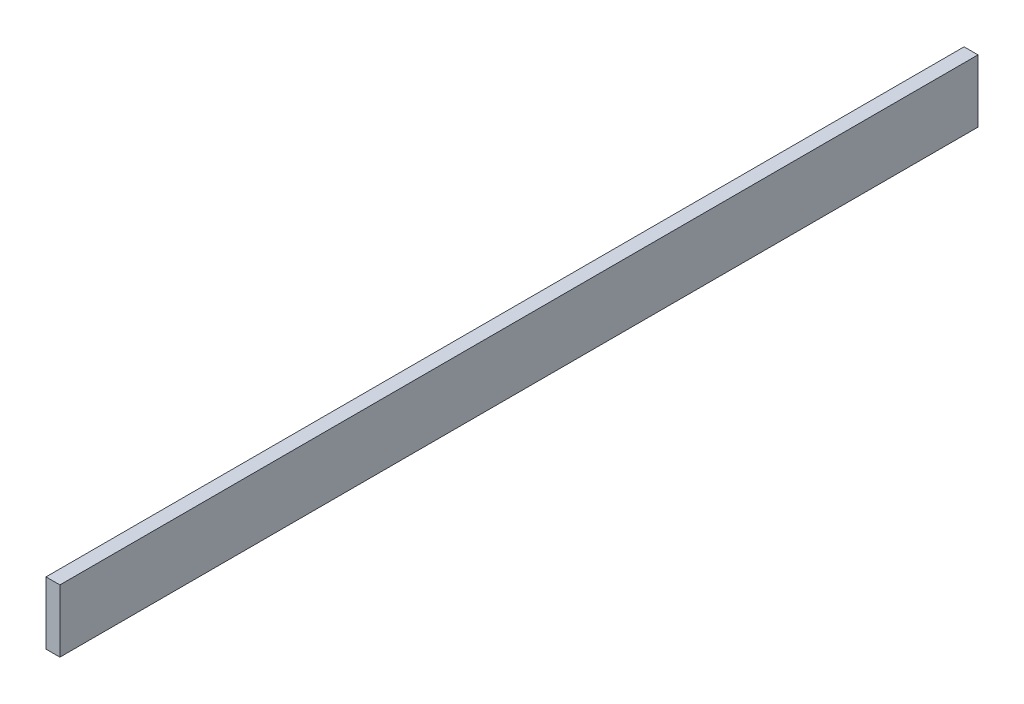
ISO-10303-21;
HEADER;
FILE_DESCRIPTION(('STEP AP214'),'2;1');
FILE_NAME('part.step','',(''),(''),'','','');
FILE_SCHEMA(('AUTOMOTIVE_DESIGN { 1 0 10303 214 1 1 1 1 }'));
ENDSEC;
DATA;
#1=APPLICATION_CONTEXT('core data for automotive mechanical design processes');
#2=APPLICATION_PROTOCOL_DEFINITION('international standard','automotive_design',2000,#1);
#3=PRODUCT_CONTEXT('',#1,'mechanical');
#4=PRODUCT('Part','Part','',(#3));
#5=PRODUCT_RELATED_PRODUCT_CATEGORY('part','',(#4));
#6=PRODUCT_DEFINITION_FORMATION('','',#4);
#7=PRODUCT_DEFINITION_CONTEXT('part definition',#1,'design');
#8=PRODUCT_DEFINITION('design','',#6,#7);
#9=PRODUCT_DEFINITION_SHAPE('','',#8);
#10=(LENGTH_UNIT() NAMED_UNIT(*) SI_UNIT(.MILLI.,.METRE.));
#11=(NAMED_UNIT(*) PLANE_ANGLE_UNIT() SI_UNIT($,.RADIAN.));
#12=(NAMED_UNIT(*) SI_UNIT($,.STERADIAN.) SOLID_ANGLE_UNIT());
#13=UNCERTAINTY_MEASURE_WITH_UNIT(LENGTH_MEASURE(1.E-05),#10,'distance_accuracy_value','');
#14=(GEOMETRIC_REPRESENTATION_CONTEXT(3) GLOBAL_UNCERTAINTY_ASSIGNED_CONTEXT((#13)) GLOBAL_UNIT_ASSIGNED_CONTEXT((#10,
#11,#12)) REPRESENTATION_CONTEXT('',''));
#15=CARTESIAN_POINT('',(0.,0.,0.));
#16=DIRECTION('',(0.,0.,1.));
#17=DIRECTION('',(1.,0.,0.));
#18=AXIS2_PLACEMENT_3D('',#15,#16,#17);
#19=CARTESIAN_POINT('',(20.,28.7695494129221,0.));
#20=DIRECTION('',(0.,-1.,0.));
#21=DIRECTION('',(0.,0.,-1.));
#22=AXIS2_PLACEMENT_3D('',#19,#20,#21);
#23=PLANE('',#22);
#24=DIRECTION('',(0.,0.,1.));
#25=VECTOR('',#24,1.);
#26=CARTESIAN_POINT('',(0.,28.7695494129221,0.));
#27=LINE('',#26,#25);
#28=CARTESIAN_POINT('',(0.,28.7695494129222,-1192.10741789365));
#29=VERTEX_POINT('',#28);
#30=CARTESIAN_POINT('',(0.,28.7695494129221,127.892582106352));
#31=VERTEX_POINT('',#30);
#32=EDGE_CURVE('E97',#29,#31,#27,.T.);
#33=ORIENTED_EDGE('',*,*,#32,.T.);
#34=DIRECTION('',(-1.,0.,0.));
#35=VECTOR('',#34,1.);
#36=CARTESIAN_POINT('',(20.,28.7695494129221,127.892582106352));
#37=LINE('',#36,#35);
#38=CARTESIAN_POINT('',(20.,28.7695494129221,127.892582106352));
#39=VERTEX_POINT('',#38);
#40=EDGE_CURVE('E11',#39,#31,#37,.T.);
#41=ORIENTED_EDGE('',*,*,#40,.F.);
#42=DIRECTION('',(0.,0.,1.));
#43=VECTOR('',#42,1.);
#44=CARTESIAN_POINT('',(20.,28.7695494129221,0.));
#45=LINE('',#44,#43);
#46=CARTESIAN_POINT('',(20.,28.7695494129222,-1192.10741789365));
#47=VERTEX_POINT('',#46);
#48=EDGE_CURVE('E83',#47,#39,#45,.T.);
#49=ORIENTED_EDGE('',*,*,#48,.F.);
#50=DIRECTION('',(-1.,0.,0.));
#51=VECTOR('',#50,1.);
#52=CARTESIAN_POINT('',(20.,28.7695494129222,-1192.10741789365));
#53=LINE('',#52,#51);
#54=EDGE_CURVE('E50',#47,#29,#53,.T.);
#55=ORIENTED_EDGE('',*,*,#54,.T.);
#56=EDGE_LOOP('',(#33,#41,#49,#55));
#57=FACE_BOUND('',#56,.T.);
#58=ADVANCED_FACE('F34',(#57),#23,.F.);
#59=CARTESIAN_POINT('',(20.,0.,127.892582106352));
#60=DIRECTION('',(0.,0.,-1.));
#61=DIRECTION('',(-1.,0.,0.));
#62=AXIS2_PLACEMENT_3D('',#59,#60,#61);
#63=PLANE('',#62);
#64=DIRECTION('',(0.,-1.,0.));
#65=VECTOR('',#64,1.);
#66=CARTESIAN_POINT('',(0.,0.,127.892582106352));
#67=LINE('',#66,#65);
#68=CARTESIAN_POINT('',(0.,-61.2304505870779,127.892582106352));
#69=VERTEX_POINT('',#68);
#70=EDGE_CURVE('E88',#31,#69,#67,.T.);
#71=ORIENTED_EDGE('',*,*,#70,.T.);
#72=DIRECTION('',(-1.,0.,0.));
#73=VECTOR('',#72,1.);
#74=CARTESIAN_POINT('',(20.,-61.2304505870779,127.892582106352));
#75=LINE('',#74,#73);
#76=CARTESIAN_POINT('',(20.,-61.2304505870779,127.892582106352));
#77=VERTEX_POINT('',#76);
#78=EDGE_CURVE('E42',#77,#69,#75,.T.);
#79=ORIENTED_EDGE('',*,*,#78,.F.);
#80=DIRECTION('',(0.,-1.,0.));
#81=VECTOR('',#80,1.);
#82=CARTESIAN_POINT('',(20.,0.,127.892582106352));
#83=LINE('',#82,#81);
#84=EDGE_CURVE('E75',#39,#77,#83,.T.);
#85=ORIENTED_EDGE('',*,*,#84,.F.);
#86=ORIENTED_EDGE('',*,*,#40,.T.);
#87=EDGE_LOOP('',(#71,#79,#85,#86));
#88=FACE_BOUND('',#87,.T.);
#89=ADVANCED_FACE('F87',(#88),#63,.F.);
#90=CARTESIAN_POINT('',(20.,-61.2304505870779,0.));
#91=DIRECTION('',(0.,-1.,0.));
#92=DIRECTION('',(0.,0.,-1.));
#93=AXIS2_PLACEMENT_3D('',#90,#91,#92);
#94=PLANE('',#93);
#95=DIRECTION('',(0.,0.,1.));
#96=VECTOR('',#95,1.);
#97=CARTESIAN_POINT('',(0.,-61.2304505870779,0.));
#98=LINE('',#97,#96);
#99=CARTESIAN_POINT('',(0.,-61.2304505870778,-1192.10741789365));
#100=VERTEX_POINT('',#99);
#101=EDGE_CURVE('E100',#100,#69,#98,.T.);
#102=ORIENTED_EDGE('',*,*,#101,.F.);
#103=DIRECTION('',(-1.,0.,0.));
#104=VECTOR('',#103,1.);
#105=CARTESIAN_POINT('',(20.,-61.2304505870778,-1192.10741789365));
#106=LINE('',#105,#104);
#107=CARTESIAN_POINT('',(20.,-61.2304505870778,-1192.10741789365));
#108=VERTEX_POINT('',#107);
#109=EDGE_CURVE('E64',#108,#100,#106,.T.);
#110=ORIENTED_EDGE('',*,*,#109,.F.);
#111=DIRECTION('',(0.,0.,1.));
#112=VECTOR('',#111,1.);
#113=CARTESIAN_POINT('',(20.,-61.2304505870779,0.));
#114=LINE('',#113,#112);
#115=EDGE_CURVE('E82',#108,#77,#114,.T.);
#116=ORIENTED_EDGE('',*,*,#115,.T.);
#117=ORIENTED_EDGE('',*,*,#78,.T.);
#118=EDGE_LOOP('',(#102,#110,#116,#117));
#119=FACE_BOUND('',#118,.T.);
#120=ADVANCED_FACE('F91',(#119),#94,.T.);
#121=CARTESIAN_POINT('',(20.,0.,-1192.10741789365));
#122=DIRECTION('',(0.,0.,-1.));
#123=DIRECTION('',(-1.,0.,0.));
#124=AXIS2_PLACEMENT_3D('',#121,#122,#123);
#125=PLANE('',#124);
#126=DIRECTION('',(0.,-1.,0.));
#127=VECTOR('',#126,1.);
#128=CARTESIAN_POINT('',(0.,0.,-1192.10741789365));
#129=LINE('',#128,#127);
#130=EDGE_CURVE('E102',#29,#100,#129,.T.);
#131=ORIENTED_EDGE('',*,*,#130,.F.);
#132=ORIENTED_EDGE('',*,*,#54,.F.);
#133=DIRECTION('',(0.,-1.,0.));
#134=VECTOR('',#133,1.);
#135=CARTESIAN_POINT('',(20.,0.,-1192.10741789365));
#136=LINE('',#135,#134);
#137=EDGE_CURVE('E92',#47,#108,#136,.T.);
#138=ORIENTED_EDGE('',*,*,#137,.T.);
#139=ORIENTED_EDGE('',*,*,#109,.T.);
#140=EDGE_LOOP('',(#131,#132,#138,#139));
#141=FACE_BOUND('',#140,.T.);
#142=ADVANCED_FACE('F108',(#141),#125,.T.);
#143=CARTESIAN_POINT('',(20.,0.,0.));
#144=DIRECTION('',(1.,0.,0.));
#145=DIRECTION('',(0.,0.,-1.));
#146=AXIS2_PLACEMENT_3D('',#143,#144,#145);
#147=PLANE('',#146);
#148=ORIENTED_EDGE('',*,*,#48,.T.);
#149=ORIENTED_EDGE('',*,*,#84,.T.);
#150=ORIENTED_EDGE('',*,*,#115,.F.);
#151=ORIENTED_EDGE('',*,*,#137,.F.);
#152=EDGE_LOOP('',(#148,#149,#150,#151));
#153=FACE_BOUND('',#152,.T.);
#154=ADVANCED_FACE('F79',(#153),#147,.T.);
#155=CARTESIAN_POINT('',(0.,0.,0.));
#156=DIRECTION('',(1.,0.,0.));
#157=DIRECTION('',(0.,0.,-1.));
#158=AXIS2_PLACEMENT_3D('',#155,#156,#157);
#159=PLANE('',#158);
#160=ORIENTED_EDGE('',*,*,#32,.F.);
#161=ORIENTED_EDGE('',*,*,#130,.T.);
#162=ORIENTED_EDGE('',*,*,#101,.T.);
#163=ORIENTED_EDGE('',*,*,#70,.F.);
#164=EDGE_LOOP('',(#160,#161,#162,#163));
#165=FACE_BOUND('',#164,.T.);
#166=ADVANCED_FACE('F107',(#165),#159,.F.);
#167=CLOSED_SHELL('',(#58,#89,#120,#142,#154,#166));
#168=MANIFOLD_SOLID_BREP('B2',#167);
#169=ADVANCED_BREP_SHAPE_REPRESENTATION('',(#18,#168),#14);
#170=SHAPE_DEFINITION_REPRESENTATION(#9,#169);
ENDSEC;
END-ISO-10303-21;
